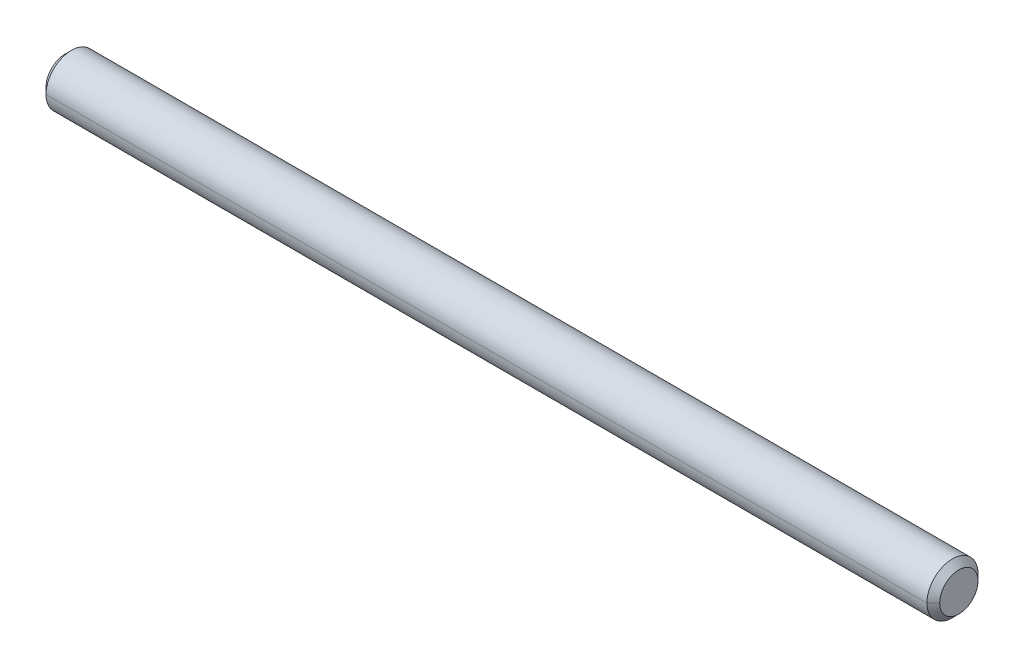
ISO-10303-21;
HEADER;
FILE_DESCRIPTION(('STEP AP214'),'2;1');
FILE_NAME('part.step','',(''),(''),'','','');
FILE_SCHEMA(('AUTOMOTIVE_DESIGN { 1 0 10303 214 1 1 1 1 }'));
ENDSEC;
DATA;
#1=APPLICATION_CONTEXT('core data for automotive mechanical design processes');
#2=APPLICATION_PROTOCOL_DEFINITION('international standard','automotive_design',2000,#1);
#3=PRODUCT_CONTEXT('',#1,'mechanical');
#4=PRODUCT('Part','Part','',(#3));
#5=PRODUCT_RELATED_PRODUCT_CATEGORY('part','',(#4));
#6=PRODUCT_DEFINITION_FORMATION('','',#4);
#7=PRODUCT_DEFINITION_CONTEXT('part definition',#1,'design');
#8=PRODUCT_DEFINITION('design','',#6,#7);
#9=PRODUCT_DEFINITION_SHAPE('','',#8);
#10=(LENGTH_UNIT() NAMED_UNIT(*) SI_UNIT(.MILLI.,.METRE.));
#11=(NAMED_UNIT(*) PLANE_ANGLE_UNIT() SI_UNIT($,.RADIAN.));
#12=(NAMED_UNIT(*) SI_UNIT($,.STERADIAN.) SOLID_ANGLE_UNIT());
#13=UNCERTAINTY_MEASURE_WITH_UNIT(LENGTH_MEASURE(1.E-05),#10,'distance_accuracy_value','');
#14=(GEOMETRIC_REPRESENTATION_CONTEXT(3) GLOBAL_UNCERTAINTY_ASSIGNED_CONTEXT((#13)) GLOBAL_UNIT_ASSIGNED_CONTEXT((#10,
#11,#12)) REPRESENTATION_CONTEXT('',''));
#15=CARTESIAN_POINT('',(0.,0.,0.));
#16=DIRECTION('',(0.,0.,1.));
#17=DIRECTION('',(1.,0.,0.));
#18=AXIS2_PLACEMENT_3D('',#15,#16,#17);
#19=CARTESIAN_POINT('',(34.5,0.,0.));
#20=DIRECTION('',(-1.,0.,0.));
#21=DIRECTION('',(0.,0.,1.));
#22=AXIS2_PLACEMENT_3D('',#19,#20,#21);
#23=CONICAL_SURFACE('',#22,2.,0.78539816339745);
#24=DIRECTION('',(-0.707106781186546,0.,-0.707106781186549));
#25=VECTOR('',#24,1.);
#26=CARTESIAN_POINT('',(34.5,0.,-2.));
#27=LINE('',#26,#25);
#28=CARTESIAN_POINT('',(35.,0.,-1.5));
#29=VERTEX_POINT('',#28);
#30=CARTESIAN_POINT('',(34.5,0.,-2.));
#31=VERTEX_POINT('',#30);
#32=EDGE_CURVE('E83',#29,#31,#27,.T.);
#33=ORIENTED_EDGE('',*,*,#32,.F.);
#34=CARTESIAN_POINT('',(35.,0.,0.));
#35=DIRECTION('',(1.,0.,0.));
#36=DIRECTION('',(0.,0.,1.));
#37=AXIS2_PLACEMENT_3D('',#34,#35,#36);
#38=CIRCLE('',#37,1.5);
#39=CARTESIAN_POINT('',(35.,0.,1.5));
#40=VERTEX_POINT('',#39);
#41=EDGE_CURVE('E72',#40,#29,#38,.T.);
#42=ORIENTED_EDGE('',*,*,#41,.F.);
#43=DIRECTION('',(-0.707106781186546,0.,0.707106781186549));
#44=VECTOR('',#43,1.);
#45=CARTESIAN_POINT('',(34.5,0.,2.));
#46=LINE('',#45,#44);
#47=CARTESIAN_POINT('',(34.5,0.,2.));
#48=VERTEX_POINT('',#47);
#49=EDGE_CURVE('E90',#40,#48,#46,.T.);
#50=ORIENTED_EDGE('',*,*,#49,.T.);
#51=CARTESIAN_POINT('',(34.5,0.,0.));
#52=DIRECTION('',(-1.,0.,0.));
#53=DIRECTION('',(0.,0.,1.));
#54=AXIS2_PLACEMENT_3D('',#51,#52,#53);
#55=CIRCLE('',#54,2.);
#56=EDGE_CURVE('E25',#31,#48,#55,.T.);
#57=ORIENTED_EDGE('',*,*,#56,.F.);
#58=EDGE_LOOP('',(#33,#42,#50,#57));
#59=FACE_BOUND('',#58,.T.);
#60=ADVANCED_FACE('F17',(#59),#23,.T.);
#61=CARTESIAN_POINT('',(-35.,0.,0.));
#62=DIRECTION('',(1.,0.,0.));
#63=DIRECTION('',(0.,0.,-1.));
#64=AXIS2_PLACEMENT_3D('',#61,#62,#63);
#65=CONICAL_SURFACE('',#64,1.49999999999998,0.78539816339745);
#66=DIRECTION('',(0.707106781186546,0.,0.707106781186549));
#67=VECTOR('',#66,1.);
#68=CARTESIAN_POINT('',(-35.,0.,1.49999999999998));
#69=LINE('',#68,#67);
#70=CARTESIAN_POINT('',(-35.,0.,1.49999999999998));
#71=VERTEX_POINT('',#70);
#72=CARTESIAN_POINT('',(-34.5,0.,2.));
#73=VERTEX_POINT('',#72);
#74=EDGE_CURVE('E97',#71,#73,#69,.T.);
#75=ORIENTED_EDGE('',*,*,#74,.F.);
#76=CARTESIAN_POINT('',(-35.,0.,0.));
#77=DIRECTION('',(-1.,0.,0.));
#78=DIRECTION('',(0.,0.,-1.));
#79=AXIS2_PLACEMENT_3D('',#76,#77,#78);
#80=CIRCLE('',#79,1.49999999999998);
#81=CARTESIAN_POINT('',(-35.,0.,-1.49999999999998));
#82=VERTEX_POINT('',#81);
#83=EDGE_CURVE('E81',#82,#71,#80,.T.);
#84=ORIENTED_EDGE('',*,*,#83,.F.);
#85=DIRECTION('',(0.707106781186546,0.,-0.707106781186549));
#86=VECTOR('',#85,1.);
#87=CARTESIAN_POINT('',(-35.,0.,-1.49999999999998));
#88=LINE('',#87,#86);
#89=CARTESIAN_POINT('',(-34.5,0.,-2.));
#90=VERTEX_POINT('',#89);
#91=EDGE_CURVE('E115',#82,#90,#88,.T.);
#92=ORIENTED_EDGE('',*,*,#91,.T.);
#93=CARTESIAN_POINT('',(-34.5,0.,0.));
#94=DIRECTION('',(1.,0.,0.));
#95=DIRECTION('',(0.,0.,-1.));
#96=AXIS2_PLACEMENT_3D('',#93,#94,#95);
#97=CIRCLE('',#96,2.);
#98=EDGE_CURVE('E11',#73,#90,#97,.T.);
#99=ORIENTED_EDGE('',*,*,#98,.F.);
#100=EDGE_LOOP('',(#75,#84,#92,#99));
#101=FACE_BOUND('',#100,.T.);
#102=ADVANCED_FACE('F131',(#101),#65,.T.);
#103=CARTESIAN_POINT('',(-35.,0.,0.));
#104=DIRECTION('',(-1.,0.,0.));
#105=DIRECTION('',(0.,0.,1.));
#106=AXIS2_PLACEMENT_3D('',#103,#104,#105);
#107=CYLINDRICAL_SURFACE('',#106,2.);
#108=DIRECTION('',(-1.,0.,0.));
#109=VECTOR('',#108,1.);
#110=CARTESIAN_POINT('',(-35.,0.,-2.));
#111=LINE('',#110,#109);
#112=EDGE_CURVE('E118',#31,#90,#111,.T.);
#113=ORIENTED_EDGE('',*,*,#112,.F.);
#114=ORIENTED_EDGE('',*,*,#56,.T.);
#115=DIRECTION('',(-1.,0.,0.));
#116=VECTOR('',#115,1.);
#117=CARTESIAN_POINT('',(-35.,0.,2.));
#118=LINE('',#117,#116);
#119=EDGE_CURVE('E121',#48,#73,#118,.T.);
#120=ORIENTED_EDGE('',*,*,#119,.T.);
#121=ORIENTED_EDGE('',*,*,#98,.T.);
#122=EDGE_LOOP('',(#113,#114,#120,#121));
#123=FACE_BOUND('',#122,.T.);
#124=ADVANCED_FACE('F138',(#123),#107,.T.);
#125=CARTESIAN_POINT('',(35.,0.,0.));
#126=DIRECTION('',(-1.,0.,0.));
#127=DIRECTION('',(0.,0.,1.));
#128=AXIS2_PLACEMENT_3D('',#125,#126,#127);
#129=PLANE('',#128);
#130=ORIENTED_EDGE('',*,*,#41,.T.);
#131=CARTESIAN_POINT('',(35.,0.,0.));
#132=DIRECTION('',(1.,0.,0.));
#133=DIRECTION('',(0.,0.,1.));
#134=AXIS2_PLACEMENT_3D('',#131,#132,#133);
#135=CIRCLE('',#134,1.5);
#136=EDGE_CURVE('E76',#29,#40,#135,.T.);
#137=ORIENTED_EDGE('',*,*,#136,.T.);
#138=EDGE_LOOP('',(#130,#137));
#139=FACE_BOUND('',#138,.T.);
#140=ADVANCED_FACE('F74',(#139),#129,.F.);
#141=CARTESIAN_POINT('',(-35.,2.,0.));
#142=DIRECTION('',(1.,0.,0.));
#143=DIRECTION('',(0.,1.,0.));
#144=AXIS2_PLACEMENT_3D('',#141,#142,#143);
#145=PLANE('',#144);
#146=ORIENTED_EDGE('',*,*,#83,.T.);
#147=CARTESIAN_POINT('',(-35.,0.,0.));
#148=DIRECTION('',(-1.,0.,0.));
#149=DIRECTION('',(0.,0.,-1.));
#150=AXIS2_PLACEMENT_3D('',#147,#148,#149);
#151=CIRCLE('',#150,1.49999999999998);
#152=EDGE_CURVE('E100',#71,#82,#151,.T.);
#153=ORIENTED_EDGE('',*,*,#152,.T.);
#154=EDGE_LOOP('',(#146,#153));
#155=FACE_BOUND('',#154,.T.);
#156=ADVANCED_FACE('F128',(#155),#145,.F.);
#157=CARTESIAN_POINT('',(-35.,0.,0.));
#158=DIRECTION('',(-1.,0.,0.));
#159=DIRECTION('',(0.,0.,1.));
#160=AXIS2_PLACEMENT_3D('',#157,#158,#159);
#161=CYLINDRICAL_SURFACE('',#160,2.);
#162=CARTESIAN_POINT('',(34.5,0.,0.));
#163=DIRECTION('',(-1.,0.,0.));
#164=DIRECTION('',(0.,0.,1.));
#165=AXIS2_PLACEMENT_3D('',#162,#163,#164);
#166=CIRCLE('',#165,2.);
#167=EDGE_CURVE('E87',#48,#31,#166,.T.);
#168=ORIENTED_EDGE('',*,*,#167,.T.);
#169=ORIENTED_EDGE('',*,*,#112,.T.);
#170=CARTESIAN_POINT('',(-34.5,0.,0.));
#171=DIRECTION('',(1.,0.,0.));
#172=DIRECTION('',(0.,0.,-1.));
#173=AXIS2_PLACEMENT_3D('',#170,#171,#172);
#174=CIRCLE('',#173,2.);
#175=EDGE_CURVE('E99',#90,#73,#174,.T.);
#176=ORIENTED_EDGE('',*,*,#175,.T.);
#177=ORIENTED_EDGE('',*,*,#119,.F.);
#178=EDGE_LOOP('',(#168,#169,#176,#177));
#179=FACE_BOUND('',#178,.T.);
#180=ADVANCED_FACE('F137',(#179),#161,.T.);
#181=CARTESIAN_POINT('',(-35.,0.,0.));
#182=DIRECTION('',(1.,0.,0.));
#183=DIRECTION('',(0.,0.,-1.));
#184=AXIS2_PLACEMENT_3D('',#181,#182,#183);
#185=CONICAL_SURFACE('',#184,1.49999999999998,0.78539816339745);
#186=ORIENTED_EDGE('',*,*,#152,.F.);
#187=ORIENTED_EDGE('',*,*,#74,.T.);
#188=ORIENTED_EDGE('',*,*,#175,.F.);
#189=ORIENTED_EDGE('',*,*,#91,.F.);
#190=EDGE_LOOP('',(#186,#187,#188,#189));
#191=FACE_BOUND('',#190,.T.);
#192=ADVANCED_FACE('F134',(#191),#185,.T.);
#193=CARTESIAN_POINT('',(34.5,0.,0.));
#194=DIRECTION('',(-1.,0.,0.));
#195=DIRECTION('',(0.,0.,1.));
#196=AXIS2_PLACEMENT_3D('',#193,#194,#195);
#197=CONICAL_SURFACE('',#196,2.,0.78539816339745);
#198=ORIENTED_EDGE('',*,*,#136,.F.);
#199=ORIENTED_EDGE('',*,*,#32,.T.);
#200=ORIENTED_EDGE('',*,*,#167,.F.);
#201=ORIENTED_EDGE('',*,*,#49,.F.);
#202=EDGE_LOOP('',(#198,#199,#200,#201));
#203=FACE_BOUND('',#202,.T.);
#204=ADVANCED_FACE('F89',(#203),#197,.T.);
#205=CLOSED_SHELL('',(#60,#102,#124,#140,#156,#180,#192,#204));
#206=MANIFOLD_SOLID_BREP('B1',#205);
#207=ADVANCED_BREP_SHAPE_REPRESENTATION('',(#18,#206),#14);
#208=SHAPE_DEFINITION_REPRESENTATION(#9,#207);
ENDSEC;
END-ISO-10303-21;
